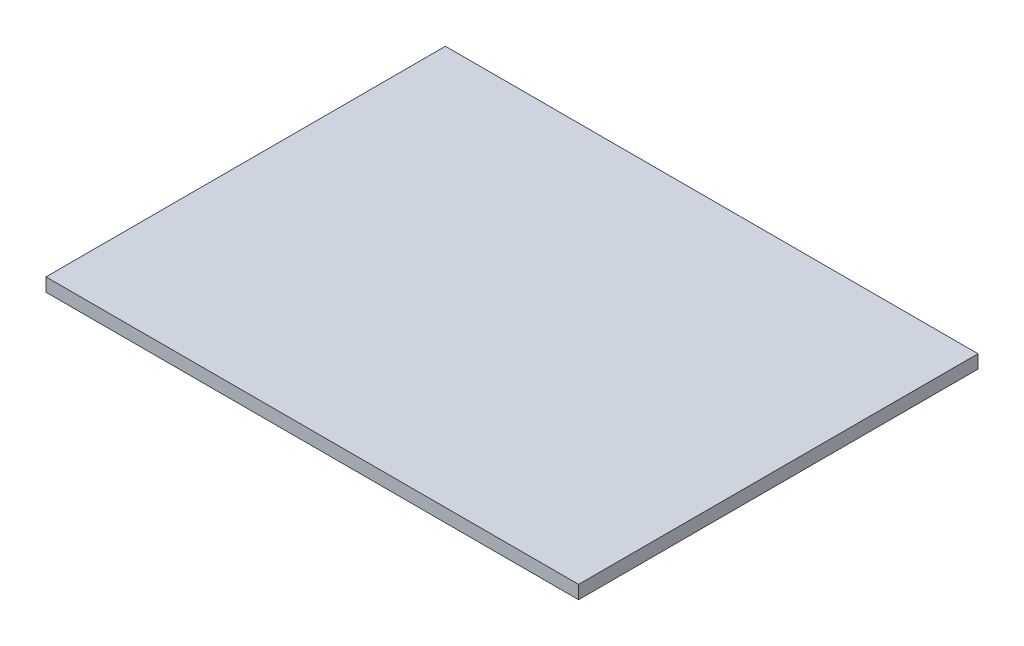
ISO-10303-21;
HEADER;
FILE_DESCRIPTION(('STEP AP214'),'2;1');
FILE_NAME('part.step','',(''),(''),'','','');
FILE_SCHEMA(('AUTOMOTIVE_DESIGN { 1 0 10303 214 1 1 1 1 }'));
ENDSEC;
DATA;
#1=APPLICATION_CONTEXT('core data for automotive mechanical design processes');
#2=APPLICATION_PROTOCOL_DEFINITION('international standard','automotive_design',2000,#1);
#3=PRODUCT_CONTEXT('',#1,'mechanical');
#4=PRODUCT('Part','Part','',(#3));
#5=PRODUCT_RELATED_PRODUCT_CATEGORY('part','',(#4));
#6=PRODUCT_DEFINITION_FORMATION('','',#4);
#7=PRODUCT_DEFINITION_CONTEXT('part definition',#1,'design');
#8=PRODUCT_DEFINITION('design','',#6,#7);
#9=PRODUCT_DEFINITION_SHAPE('','',#8);
#10=(LENGTH_UNIT() NAMED_UNIT(*) SI_UNIT(.MILLI.,.METRE.));
#11=(NAMED_UNIT(*) PLANE_ANGLE_UNIT() SI_UNIT($,.RADIAN.));
#12=(NAMED_UNIT(*) SI_UNIT($,.STERADIAN.) SOLID_ANGLE_UNIT());
#13=UNCERTAINTY_MEASURE_WITH_UNIT(LENGTH_MEASURE(1.E-05),#10,'distance_accuracy_value','');
#14=(GEOMETRIC_REPRESENTATION_CONTEXT(3) GLOBAL_UNCERTAINTY_ASSIGNED_CONTEXT((#13)) GLOBAL_UNIT_ASSIGNED_CONTEXT((#10,
#11,#12)) REPRESENTATION_CONTEXT('',''));
#15=CARTESIAN_POINT('',(0.,0.,0.));
#16=DIRECTION('',(0.,0.,1.));
#17=DIRECTION('',(1.,0.,0.));
#18=AXIS2_PLACEMENT_3D('',#15,#16,#17);
#19=CARTESIAN_POINT('',(20.,1.,15.));
#20=DIRECTION('',(-1.,0.,0.));
#21=DIRECTION('',(0.,0.,1.));
#22=AXIS2_PLACEMENT_3D('',#19,#20,#21);
#23=PLANE('',#22);
#24=DIRECTION('',(0.,0.,-1.));
#25=VECTOR('',#24,1.);
#26=CARTESIAN_POINT('',(20.,0.,15.));
#27=LINE('',#26,#25);
#28=CARTESIAN_POINT('',(20.,0.,15.));
#29=VERTEX_POINT('',#28);
#30=CARTESIAN_POINT('',(20.,0.,-15.));
#31=VERTEX_POINT('',#30);
#32=EDGE_CURVE('E103',#29,#31,#27,.T.);
#33=ORIENTED_EDGE('',*,*,#32,.T.);
#34=DIRECTION('',(0.,-1.,0.));
#35=VECTOR('',#34,1.);
#36=CARTESIAN_POINT('',(20.,1.,-15.));
#37=LINE('',#36,#35);
#38=CARTESIAN_POINT('',(20.,1.,-15.));
#39=VERTEX_POINT('',#38);
#40=EDGE_CURVE('E11',#39,#31,#37,.T.);
#41=ORIENTED_EDGE('',*,*,#40,.F.);
#42=DIRECTION('',(0.,0.,-1.));
#43=VECTOR('',#42,1.);
#44=CARTESIAN_POINT('',(20.,1.,15.));
#45=LINE('',#44,#43);
#46=CARTESIAN_POINT('',(20.,1.,15.));
#47=VERTEX_POINT('',#46);
#48=EDGE_CURVE('E91',#47,#39,#45,.T.);
#49=ORIENTED_EDGE('',*,*,#48,.F.);
#50=DIRECTION('',(0.,-1.,0.));
#51=VECTOR('',#50,1.);
#52=CARTESIAN_POINT('',(20.,1.,15.));
#53=LINE('',#52,#51);
#54=EDGE_CURVE('E99',#47,#29,#53,.T.);
#55=ORIENTED_EDGE('',*,*,#54,.T.);
#56=EDGE_LOOP('',(#33,#41,#49,#55));
#57=FACE_BOUND('',#56,.T.);
#58=ADVANCED_FACE('F40',(#57),#23,.F.);
#59=CARTESIAN_POINT('',(-20.,1.,-15.));
#60=DIRECTION('',(0.,0.,1.));
#61=DIRECTION('',(1.,0.,0.));
#62=AXIS2_PLACEMENT_3D('',#59,#60,#61);
#63=PLANE('',#62);
#64=DIRECTION('',(-1.,0.,0.));
#65=VECTOR('',#64,1.);
#66=CARTESIAN_POINT('',(-20.,0.,-15.));
#67=LINE('',#66,#65);
#68=CARTESIAN_POINT('',(-20.,0.,-15.));
#69=VERTEX_POINT('',#68);
#70=EDGE_CURVE('E95',#31,#69,#67,.T.);
#71=ORIENTED_EDGE('',*,*,#70,.T.);
#72=DIRECTION('',(0.,-1.,0.));
#73=VECTOR('',#72,1.);
#74=CARTESIAN_POINT('',(-20.,1.,-15.));
#75=LINE('',#74,#73);
#76=CARTESIAN_POINT('',(-20.,1.,-15.));
#77=VERTEX_POINT('',#76);
#78=EDGE_CURVE('E48',#77,#69,#75,.T.);
#79=ORIENTED_EDGE('',*,*,#78,.F.);
#80=DIRECTION('',(-1.,0.,0.));
#81=VECTOR('',#80,1.);
#82=CARTESIAN_POINT('',(-20.,1.,-15.));
#83=LINE('',#82,#81);
#84=EDGE_CURVE('E86',#39,#77,#83,.T.);
#85=ORIENTED_EDGE('',*,*,#84,.F.);
#86=ORIENTED_EDGE('',*,*,#40,.T.);
#87=EDGE_LOOP('',(#71,#79,#85,#86));
#88=FACE_BOUND('',#87,.T.);
#89=ADVANCED_FACE('F94',(#88),#63,.F.);
#90=CARTESIAN_POINT('',(-20.,1.,15.));
#91=DIRECTION('',(1.,0.,0.));
#92=DIRECTION('',(0.,0.,-1.));
#93=AXIS2_PLACEMENT_3D('',#90,#91,#92);
#94=PLANE('',#93);
#95=DIRECTION('',(0.,0.,1.));
#96=VECTOR('',#95,1.);
#97=CARTESIAN_POINT('',(-20.,0.,15.));
#98=LINE('',#97,#96);
#99=CARTESIAN_POINT('',(-20.,0.,15.));
#100=VERTEX_POINT('',#99);
#101=EDGE_CURVE('E73',#69,#100,#98,.T.);
#102=ORIENTED_EDGE('',*,*,#101,.T.);
#103=DIRECTION('',(0.,-1.,0.));
#104=VECTOR('',#103,1.);
#105=CARTESIAN_POINT('',(-20.,1.,15.));
#106=LINE('',#105,#104);
#107=CARTESIAN_POINT('',(-20.,1.,15.));
#108=VERTEX_POINT('',#107);
#109=EDGE_CURVE('E96',#108,#100,#106,.T.);
#110=ORIENTED_EDGE('',*,*,#109,.F.);
#111=DIRECTION('',(0.,0.,1.));
#112=VECTOR('',#111,1.);
#113=CARTESIAN_POINT('',(-20.,1.,15.));
#114=LINE('',#113,#112);
#115=EDGE_CURVE('E89',#77,#108,#114,.T.);
#116=ORIENTED_EDGE('',*,*,#115,.F.);
#117=ORIENTED_EDGE('',*,*,#78,.T.);
#118=EDGE_LOOP('',(#102,#110,#116,#117));
#119=FACE_BOUND('',#118,.T.);
#120=ADVANCED_FACE('F97',(#119),#94,.F.);
#121=CARTESIAN_POINT('',(-20.,1.,15.));
#122=DIRECTION('',(0.,0.,-1.));
#123=DIRECTION('',(-1.,0.,0.));
#124=AXIS2_PLACEMENT_3D('',#121,#122,#123);
#125=PLANE('',#124);
#126=DIRECTION('',(1.,0.,0.));
#127=VECTOR('',#126,1.);
#128=CARTESIAN_POINT('',(-20.,0.,15.));
#129=LINE('',#128,#127);
#130=EDGE_CURVE('E79',#100,#29,#129,.T.);
#131=ORIENTED_EDGE('',*,*,#130,.T.);
#132=ORIENTED_EDGE('',*,*,#54,.F.);
#133=DIRECTION('',(1.,0.,0.));
#134=VECTOR('',#133,1.);
#135=CARTESIAN_POINT('',(-20.,1.,15.));
#136=LINE('',#135,#134);
#137=EDGE_CURVE('E56',#108,#47,#136,.T.);
#138=ORIENTED_EDGE('',*,*,#137,.F.);
#139=ORIENTED_EDGE('',*,*,#109,.T.);
#140=EDGE_LOOP('',(#131,#132,#138,#139));
#141=FACE_BOUND('',#140,.T.);
#142=ADVANCED_FACE('F110',(#141),#125,.F.);
#143=CARTESIAN_POINT('',(0.,1.,0.));
#144=DIRECTION('',(0.,-1.,0.));
#145=DIRECTION('',(0.,0.,-1.));
#146=AXIS2_PLACEMENT_3D('',#143,#144,#145);
#147=PLANE('',#146);
#148=ORIENTED_EDGE('',*,*,#48,.T.);
#149=ORIENTED_EDGE('',*,*,#84,.T.);
#150=ORIENTED_EDGE('',*,*,#115,.T.);
#151=ORIENTED_EDGE('',*,*,#137,.T.);
#152=EDGE_LOOP('',(#148,#149,#150,#151));
#153=FACE_BOUND('',#152,.T.);
#154=ADVANCED_FACE('F87',(#153),#147,.F.);
#155=CARTESIAN_POINT('',(0.,0.,0.));
#156=DIRECTION('',(0.,-1.,0.));
#157=DIRECTION('',(0.,0.,-1.));
#158=AXIS2_PLACEMENT_3D('',#155,#156,#157);
#159=PLANE('',#158);
#160=ORIENTED_EDGE('',*,*,#32,.F.);
#161=ORIENTED_EDGE('',*,*,#130,.F.);
#162=ORIENTED_EDGE('',*,*,#101,.F.);
#163=ORIENTED_EDGE('',*,*,#70,.F.);
#164=EDGE_LOOP('',(#160,#161,#162,#163));
#165=FACE_BOUND('',#164,.T.);
#166=ADVANCED_FACE('F113',(#165),#159,.T.);
#167=CLOSED_SHELL('',(#58,#89,#120,#142,#154,#166));
#168=MANIFOLD_SOLID_BREP('B2',#167);
#169=ADVANCED_BREP_SHAPE_REPRESENTATION('',(#18,#168),#14);
#170=SHAPE_DEFINITION_REPRESENTATION(#9,#169);
ENDSEC;
END-ISO-10303-21;
